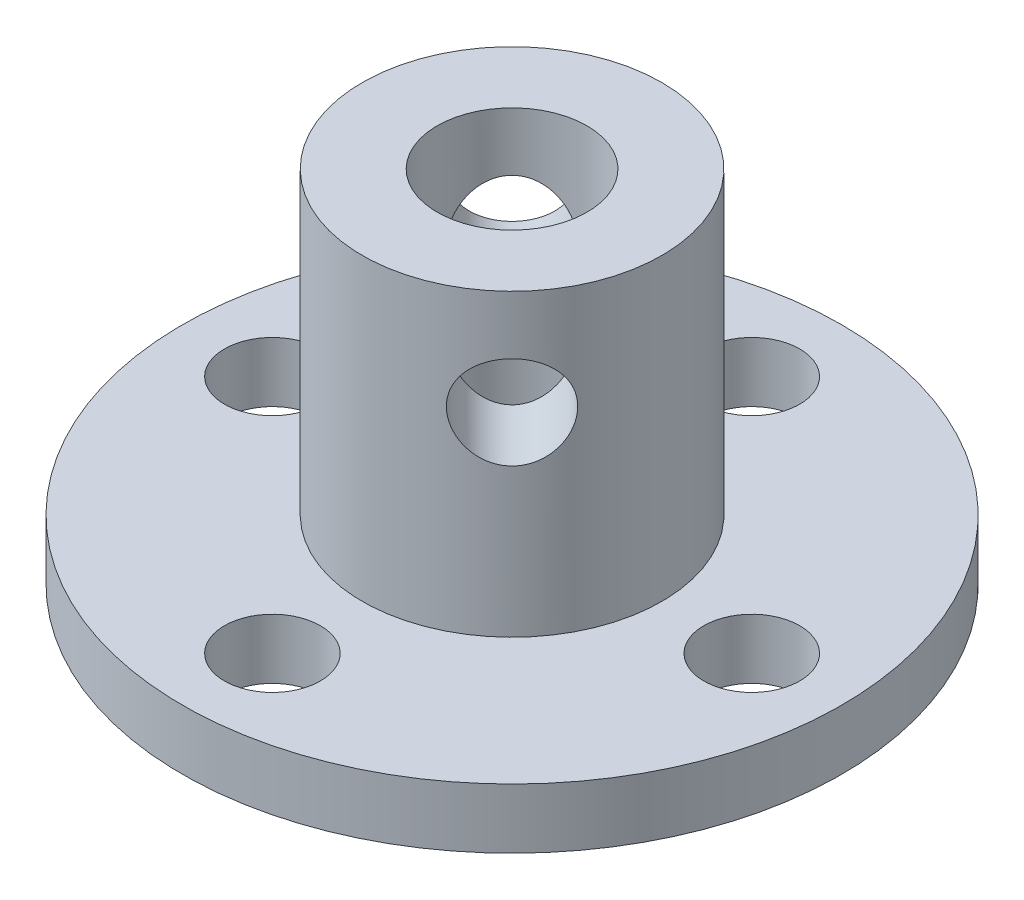
ISO-10303-21;
HEADER;
FILE_DESCRIPTION(('STEP AP214'),'2;1');
FILE_NAME('part.step','',(''),(''),'','','');
FILE_SCHEMA(('AUTOMOTIVE_DESIGN { 1 0 10303 214 1 1 1 1 }'));
ENDSEC;
DATA;
#1=APPLICATION_CONTEXT('core data for automotive mechanical design processes');
#2=APPLICATION_PROTOCOL_DEFINITION('international standard','automotive_design',2000,#1);
#3=PRODUCT_CONTEXT('',#1,'mechanical');
#4=PRODUCT('Part','Part','',(#3));
#5=PRODUCT_RELATED_PRODUCT_CATEGORY('part','',(#4));
#6=PRODUCT_DEFINITION_FORMATION('','',#4);
#7=PRODUCT_DEFINITION_CONTEXT('part definition',#1,'design');
#8=PRODUCT_DEFINITION('design','',#6,#7);
#9=PRODUCT_DEFINITION_SHAPE('','',#8);
#10=(LENGTH_UNIT() NAMED_UNIT(*) SI_UNIT(.MILLI.,.METRE.));
#11=(NAMED_UNIT(*) PLANE_ANGLE_UNIT() SI_UNIT($,.RADIAN.));
#12=(NAMED_UNIT(*) SI_UNIT($,.STERADIAN.) SOLID_ANGLE_UNIT());
#13=UNCERTAINTY_MEASURE_WITH_UNIT(LENGTH_MEASURE(1.E-05),#10,'distance_accuracy_value','');
#14=(GEOMETRIC_REPRESENTATION_CONTEXT(3) GLOBAL_UNCERTAINTY_ASSIGNED_CONTEXT((#13)) GLOBAL_UNIT_ASSIGNED_CONTEXT((#10,
#11,#12)) REPRESENTATION_CONTEXT('',''));
#15=CARTESIAN_POINT('',(0.,0.,0.));
#16=DIRECTION('',(0.,0.,1.));
#17=DIRECTION('',(1.,0.,0.));
#18=AXIS2_PLACEMENT_3D('',#15,#16,#17);
#19=CARTESIAN_POINT('',(0.,0.,0.));
#20=DIRECTION('',(0.,-1.,0.));
#21=DIRECTION('',(0.,0.,-1.));
#22=AXIS2_PLACEMENT_3D('',#19,#20,#21);
#23=CYLINDRICAL_SURFACE('',#22,2.5);
#24=CARTESIAN_POINT('',(0.,12.0139670732778,0.));
#25=DIRECTION('',(0.,-1.,0.));
#26=DIRECTION('',(0.,0.,-1.));
#27=AXIS2_PLACEMENT_3D('',#24,#25,#26);
#28=CIRCLE('',#27,2.5);
#29=CARTESIAN_POINT('',(0.,12.0139670732778,-2.5));
#30=VERTEX_POINT('',#29);
#31=EDGE_CURVE('E67',#30,#30,#28,.T.);
#32=ORIENTED_EDGE('',*,*,#31,.F.);
#33=EDGE_LOOP('',(#32));
#34=FACE_BOUND('',#33,.T.);
#35=CARTESIAN_POINT('',(0.,0.0139670732778078,0.));
#36=DIRECTION('',(0.,-1.,0.));
#37=DIRECTION('',(0.,0.,-1.));
#38=AXIS2_PLACEMENT_3D('',#35,#36,#37);
#39=CIRCLE('',#38,2.5);
#40=CARTESIAN_POINT('',(0.,0.0139670732778078,-2.5));
#41=VERTEX_POINT('',#40);
#42=EDGE_CURVE('E10',#41,#41,#39,.T.);
#43=ORIENTED_EDGE('',*,*,#42,.T.);
#44=EDGE_LOOP('',(#43));
#45=FACE_BOUND('',#44,.T.);
#46=CARTESIAN_POINT('',(-2.48300866150717,8.51396707327781,-0.290977639828875));
#47=CARTESIAN_POINT('',(-2.48301113966516,8.43677846113261,-0.290988913635933));
#48=CARTESIAN_POINT('',(-2.48217612182908,8.3594624686657,-0.298373614279475));
#49=CARTESIAN_POINT('',(-2.47855385305562,8.2074173488581,-0.32705265901617));
#50=CARTESIAN_POINT('',(-2.47576111152277,8.13269611881318,-0.348386112173273));
#51=CARTESIAN_POINT('',(-2.46752440485184,7.98850263384684,-0.402565620860833));
#52=CARTESIAN_POINT('',(-2.46210297547763,7.91899145862871,-0.435313164166938));
#53=CARTESIAN_POINT('',(-2.4477226834508,7.7855720301307,-0.509997366260961));
#54=CARTESIAN_POINT('',(-2.43876382786972,7.72166376565054,-0.551934006679204));
#55=CARTESIAN_POINT('',(-2.41488701565074,7.59200046229165,-0.648945098969827));
#56=CARTESIAN_POINT('',(-2.39933945336666,7.52711144477242,-0.705022520101217));
#57=CARTESIAN_POINT('',(-2.36118189666039,7.40601784165841,-0.823845195773164));
#58=CARTESIAN_POINT('',(-2.33856586237307,7.34982074475389,-0.88659612232111));
#59=CARTESIAN_POINT('',(-2.28192597229858,7.24113691394154,-1.02419487374636));
#60=CARTESIAN_POINT('',(-2.24687081918732,7.18987071508026,-1.09959635294627));
#61=CARTESIAN_POINT('',(-2.16531241404793,7.10161600397076,-1.2525599268235));
#62=CARTESIAN_POINT('',(-2.11882041497775,7.06461354863611,-1.33011983165121));
#63=CARTESIAN_POINT('',(-2.01956902748121,7.00993183833016,-1.47591284545831));
#64=CARTESIAN_POINT('',(-1.96790783367433,6.990685294592,-1.54430042757617));
#65=CARTESIAN_POINT('',(-1.85634664293677,6.96673354831023,-1.67673632370969));
#66=CARTESIAN_POINT('',(-1.79645518444065,6.96201339267015,-1.74078903344187));
#67=CARTESIAN_POINT('',(-1.67896376191841,6.96704686840859,-1.8538722628384));
#68=CARTESIAN_POINT('',(-1.62210670976644,6.97497040446625,-1.9037693991826));
#69=CARTESIAN_POINT('',(-1.5056873068039,7.00154356687289,-1.99711570422354));
#70=CARTESIAN_POINT('',(-1.44612475179436,7.02019400408232,-2.04056438516073));
#71=CARTESIAN_POINT('',(-1.32605698425397,7.06743224779019,-2.12056629360198));
#72=CARTESIAN_POINT('',(-1.26554933285099,7.09605223093485,-2.15709659550747));
#73=CARTESIAN_POINT('',(-1.14559225584083,7.1621617853784,-2.2231312801619));
#74=CARTESIAN_POINT('',(-1.08614308135278,7.19965343207021,-2.25263401567136));
#75=CARTESIAN_POINT('',(-0.962734337897817,7.28764010976322,-2.30830479218215));
#76=CARTESIAN_POINT('',(-0.899124408316367,7.33916920447274,-2.33361107855223));
#77=CARTESIAN_POINT('',(-0.777351283051172,7.45109899040097,-2.37695462987184));
#78=CARTESIAN_POINT('',(-0.719196106739299,7.51151241830252,-2.39498131735296));
#79=CARTESIAN_POINT('',(-0.603700581925183,7.64857294661088,-2.42684344838833));
#80=CARTESIAN_POINT('',(-0.547411508624077,7.72630784930012,-2.43985033900821));
#81=CARTESIAN_POINT('',(-0.448650040605218,7.89078103363736,-2.45993142775213));
#82=CARTESIAN_POINT('',(-0.406152147150563,7.97750230385729,-2.4670166132866));
#83=CARTESIAN_POINT('',(-0.348155928567997,8.13449345961273,-2.4757653126558));
#84=CARTESIAN_POINT('',(-0.328510335770779,8.20317695834715,-2.47835958680787));
#85=CARTESIAN_POINT('',(-0.300940482701998,8.34287009594469,-2.48186134033485));
#86=CARTESIAN_POINT('',(-0.293000704338461,8.41387652740023,-2.48277105329901));
#87=CARTESIAN_POINT('',(-0.289634697403295,8.55634233982426,-2.48316652124736));
#88=CARTESIAN_POINT('',(-0.294234655622526,8.62780235727898,-2.48264929632335));
#89=CARTESIAN_POINT('',(-0.315512571191251,8.7688882668457,-2.48003226794745));
#90=CARTESIAN_POINT('',(-0.332200462979969,8.83851260149722,-2.47793116272951));
#91=CARTESIAN_POINT('',(-0.375824848139076,8.97329275034844,-2.47168503001512));
#92=CARTESIAN_POINT('',(-0.40262326643552,9.03849538957133,-2.46756732596672));
#93=CARTESIAN_POINT('',(-0.464665656065021,9.16447483079389,-2.45663920224406));
#94=CARTESIAN_POINT('',(-0.499912654939246,9.22525003602341,-2.44982781672157));
#95=CARTESIAN_POINT('',(-0.584448365781772,9.35281500683417,-2.43117773014678));
#96=CARTESIAN_POINT('',(-0.635131592028858,9.41857776472977,-2.41863321884564));
#97=CARTESIAN_POINT('',(-0.743646591620364,9.54238494127723,-2.38750564114829));
#98=CARTESIAN_POINT('',(-0.801485672414544,9.60042134226092,-2.36891636987151));
#99=CARTESIAN_POINT('',(-0.93154424839265,9.7162070886581,-2.32114795996202));
#100=CARTESIAN_POINT('',(-1.00460678046814,9.77253670796708,-2.29077907846926));
#101=CARTESIAN_POINT('',(-1.15432243498538,9.87198173576878,-2.21910170268684));
#102=CARTESIAN_POINT('',(-1.23097368665244,9.91510394268841,-2.17779885706388));
#103=CARTESIAN_POINT('',(-1.3795590316548,9.98378629966105,-2.08660631819013));
#104=CARTESIAN_POINT('',(-1.45148713309928,10.0102791045275,-2.03741857202914));
#105=CARTESIAN_POINT('',(-1.59208586805897,10.0481155491427,-1.92952779526033));
#106=CARTESIAN_POINT('',(-1.66076071965088,10.0594793537553,-1.87083754750824));
#107=CARTESIAN_POINT('',(-1.78216921300407,10.0657837739214,-1.75495862400319));
#108=CARTESIAN_POINT('',(-1.83577117456612,10.0628643982258,-1.69878331305819));
#109=CARTESIAN_POINT('',(-1.93672733512432,10.0455666539602,-1.58271862889138));
#110=CARTESIAN_POINT('',(-1.98408173410195,10.0311886522792,-1.52282937464136));
#111=CARTESIAN_POINT('',(-2.07027646916764,9.99233315527852,-1.40329163822625));
#112=CARTESIAN_POINT('',(-2.10933360655769,9.96817936469966,-1.34369224041471));
#113=CARTESIAN_POINT('',(-2.18053469199091,9.91078814134837,-1.22477617153144));
#114=CARTESIAN_POINT('',(-2.21267741311285,9.87754909882513,-1.16545955246003));
#115=CARTESIAN_POINT('',(-2.27335468491183,9.79906333775194,-1.0426080785114));
#116=CARTESIAN_POINT('',(-2.30115576354191,9.75292215688639,-0.979284466016741));
#117=CARTESIAN_POINT('',(-2.3494722557796,9.65188375814969,-0.85692332328773));
#118=CARTESIAN_POINT('',(-2.36997926422846,9.59697654377177,-0.797890799689517));
#119=CARTESIAN_POINT('',(-2.40716561061507,9.47099841242396,-0.678236947556122));
#120=CARTESIAN_POINT('',(-2.42289783021863,9.3987400437893,-0.61856477966634));
#121=CARTESIAN_POINT('',(-2.44788878392887,9.24500242671703,-0.51078802328311));
#122=CARTESIAN_POINT('',(-2.4571515302649,9.16352892980405,-0.462676277430287));
#123=CARTESIAN_POINT('',(-2.46943482027336,9.01168914833024,-0.391036588535258));
#124=CARTESIAN_POINT('',(-2.47338303267701,8.9428537329483,-0.364424613038904));
#125=CARTESIAN_POINT('',(-2.47916014627634,8.80177271359199,-0.322827872056454));
#126=CARTESIAN_POINT('',(-2.48099587218898,8.7295388804901,-0.307805715985435));
#127=CARTESIAN_POINT('',(-2.48235257585556,8.63295465826136,-0.296529506160038));
#128=CARTESIAN_POINT('',(-2.48259955048018,8.60921128396243,-0.294451966379689));
#129=CARTESIAN_POINT('',(-2.48292722976129,8.56163836082481,-0.291674133259536));
#130=CARTESIAN_POINT('',(-2.48300789606331,8.5378087933771,-0.290974157618936));
#131=CARTESIAN_POINT('',(-2.48300866150717,8.51396707327781,-0.290977639828875));
#132=B_SPLINE_CURVE_WITH_KNOTS('',3,(#46,#47,#48,#49,#50,#51,#52,#53,#54,#55,#56,#57,#58,#59,
#60,#61,#62,#63,#64,#65,#66,#67,#68,#69,#70,#71,#72,#73,#74,#75,#76,#77,#78,#79,#80,#81,#82,#83,
#84,#85,#86,#87,#88,#89,#90,#91,#92,#93,#94,#95,#96,#97,#98,#99,#100,#101,#102,#103,#104,#105,
#106,#107,#108,#109,#110,#111,#112,#113,#114,#115,#116,#117,#118,#119,#120,#121,#122,#123,#124,
#125,#126,#127,#128,#129,#130,#131),.UNSPECIFIED.,.T.,.F.,(4,2,2,2,2,2,2,2,2,2,2,2,2,2,2,2,2,2,
2,2,2,2,2,2,2,2,2,2,2,2,2,2,2,2,2,2,2,2,2,2,2,2,4),(0.,0.231456339426909,0.463564427654229,
0.693716921414024,0.923868955086429,1.18434367634497,1.44504157926139,1.7365052726148,
2.02768332765056,2.28962147159727,2.55128989270335,2.77838248441688,3.00549224461248,
3.23334189748081,3.46124490515298,3.71729257741081,3.9737109671375,4.26285545981545,
4.55146226161879,4.76501730225856,4.97828898320938,5.19200638140646,5.40589962230755,
5.61697175694569,5.82811964246893,6.07908480116541,6.33030839041904,6.62020835252442,
6.90995883880151,7.18151717561235,7.45271319916047,7.68463598418857,7.9165513436777,
8.14134480760435,8.36617812692507,8.61462416793252,8.8633555796891,9.14715079466205,
9.43076984923751,9.65163722229324,9.87178902774295,9.94326388514901,10.0147552244342),.UNSPECIFIED.);
#133=CARTESIAN_POINT('',(-2.48300866150717,8.51396707327781,-0.290977639828875));
#134=VERTEX_POINT('',#133);
#135=EDGE_CURVE('E90',#134,#134,#132,.T.);
#136=ORIENTED_EDGE('',*,*,#135,.F.);
#137=EDGE_LOOP('',(#136));
#138=FACE_BOUND('',#137,.T.);
#139=CARTESIAN_POINT('',(0.290977639828865,8.51396707327781,2.48300866150717));
#140=CARTESIAN_POINT('',(0.290988913635924,8.591155685423,2.48301113966515));
#141=CARTESIAN_POINT('',(0.298373614279466,8.66847167788991,2.48217612182908));
#142=CARTESIAN_POINT('',(0.327052659016161,8.8205167976975,2.47855385305562));
#143=CARTESIAN_POINT('',(0.348386112173264,8.89523802774243,2.47576111152277));
#144=CARTESIAN_POINT('',(0.402565620860824,9.03943151270877,2.46752440485184));
#145=CARTESIAN_POINT('',(0.435313164166929,9.1089426879269,2.46210297547763));
#146=CARTESIAN_POINT('',(0.509997366260951,9.24236211642492,2.4477226834508));
#147=CARTESIAN_POINT('',(0.551934006679195,9.30627038090507,2.43876382786972));
#148=CARTESIAN_POINT('',(0.648945098969817,9.43593368426396,2.41488701565074));
#149=CARTESIAN_POINT('',(0.705022520101206,9.50082270178319,2.39933945336667));
#150=CARTESIAN_POINT('',(0.823845195773153,9.6219163048972,2.36118189666039));
#151=CARTESIAN_POINT('',(0.886596122321099,9.67811340180172,2.33856586237307));
#152=CARTESIAN_POINT('',(1.02419487374635,9.78679723261407,2.28192597229859));
#153=CARTESIAN_POINT('',(1.09959635294626,9.83806343147536,2.24687081918733));
#154=CARTESIAN_POINT('',(1.25255992682349,9.92631814258485,2.16531241404794));
#155=CARTESIAN_POINT('',(1.3301198316512,9.9633205979195,2.11882041497775));
#156=CARTESIAN_POINT('',(1.4759128454583,10.0180023082254,2.01956902748121));
#157=CARTESIAN_POINT('',(1.54430042757616,10.0372488519636,1.96790783367434));
#158=CARTESIAN_POINT('',(1.67673632370968,10.0612005982454,1.85634664293678));
#159=CARTESIAN_POINT('',(1.74078903344186,10.0659207538855,1.79645518444066));
#160=CARTESIAN_POINT('',(1.85387226283839,10.060887278147,1.67896376191842));
#161=CARTESIAN_POINT('',(1.90376939918259,10.0529637420894,1.62210670976645));
#162=CARTESIAN_POINT('',(1.99711570422354,10.0263905796827,1.50568730680391));
#163=CARTESIAN_POINT('',(2.04056438516073,10.0077401424733,1.44612475179436));
#164=CARTESIAN_POINT('',(2.12056629360198,9.96050189876543,1.32605698425398));
#165=CARTESIAN_POINT('',(2.15709659550746,9.93188191562076,1.265549332851));
#166=CARTESIAN_POINT('',(2.22313128016189,9.86577236117722,1.14559225584084));
#167=CARTESIAN_POINT('',(2.25263401567135,9.82828071448541,1.08614308135279));
#168=CARTESIAN_POINT('',(2.30830479218214,9.74029403679239,0.962734337897826));
#169=CARTESIAN_POINT('',(2.33361107855223,9.68876494208287,0.899124408316376));
#170=CARTESIAN_POINT('',(2.37695462987183,9.57683515615465,0.777351283051182));
#171=CARTESIAN_POINT('',(2.39498131735296,9.51642172825309,0.719196106739309));
#172=CARTESIAN_POINT('',(2.42684344838833,9.37936119994474,0.603700581925193));
#173=CARTESIAN_POINT('',(2.4398503390082,9.30162629725549,0.547411508624086));
#174=CARTESIAN_POINT('',(2.45993142775213,9.13715311291826,0.448650040605227));
#175=CARTESIAN_POINT('',(2.4670166132866,9.05043184269833,0.406152147150572));
#176=CARTESIAN_POINT('',(2.4757653126558,8.89344068694289,0.348155928568007));
#177=CARTESIAN_POINT('',(2.47835958680787,8.82475718820847,0.32851033577079));
#178=CARTESIAN_POINT('',(2.48186134033485,8.68506405061092,0.300940482702008));
#179=CARTESIAN_POINT('',(2.48277105329901,8.61405761915538,0.29300070433847));
#180=CARTESIAN_POINT('',(2.48316652124736,8.47159180673136,0.289634697403303));
#181=CARTESIAN_POINT('',(2.48264929632335,8.40013178927664,0.294234655622536));
#182=CARTESIAN_POINT('',(2.48003226794745,8.25904587970991,0.315512571191261));
#183=CARTESIAN_POINT('',(2.47793116272951,8.1894215450584,0.332200462979978));
#184=CARTESIAN_POINT('',(2.47168503001512,8.05464139620717,0.375824848139085));
#185=CARTESIAN_POINT('',(2.46756732596671,7.98943875698428,0.402623266435529));
#186=CARTESIAN_POINT('',(2.45663920224406,7.86345931576172,0.464665656065029));
#187=CARTESIAN_POINT('',(2.44982781672157,7.8026841105322,0.499912654939255));
#188=CARTESIAN_POINT('',(2.43117773014678,7.67511913972144,0.584448365781778));
#189=CARTESIAN_POINT('',(2.41863321884563,7.60935638182585,0.635131592028864));
#190=CARTESIAN_POINT('',(2.38750564114828,7.48554920527839,0.743646591620369));
#191=CARTESIAN_POINT('',(2.36891636987151,7.4275128042947,0.801485672414549));
#192=CARTESIAN_POINT('',(2.32114795996202,7.31172705789751,0.931544248392655));
#193=CARTESIAN_POINT('',(2.29077907846926,7.25539743858854,1.00460678046815));
#194=CARTESIAN_POINT('',(2.21910170268684,7.15595241078683,1.15432243498538));
#195=CARTESIAN_POINT('',(2.17779885706388,7.11283020386721,1.23097368665244));
#196=CARTESIAN_POINT('',(2.08660631819013,7.04414784689457,1.37955903165481));
#197=CARTESIAN_POINT('',(2.03741857202913,7.01765504202814,1.45148713309929));
#198=CARTESIAN_POINT('',(1.92952779526033,6.97981859741287,1.59208586805897));
#199=CARTESIAN_POINT('',(1.87083754750823,6.96845479280031,1.66076071965089));
#200=CARTESIAN_POINT('',(1.75495862400318,6.96215037263419,1.78216921300408));
#201=CARTESIAN_POINT('',(1.69878331305819,6.96506974832984,1.83577117456613));
#202=CARTESIAN_POINT('',(1.58271862889138,6.98236749259538,1.93672733512432));
#203=CARTESIAN_POINT('',(1.52282937464136,6.99674549427638,1.98408173410195));
#204=CARTESIAN_POINT('',(1.40329163822625,7.03560099127709,2.07027646916765));
#205=CARTESIAN_POINT('',(1.3436922404147,7.05975478185595,2.1093336065577));
#206=CARTESIAN_POINT('',(1.22477617153143,7.11714600520724,2.18053469199092));
#207=CARTESIAN_POINT('',(1.16545955246002,7.15038504773048,2.21267741311285));
#208=CARTESIAN_POINT('',(1.04260807851139,7.22887080880367,2.27335468491183));
#209=CARTESIAN_POINT('',(0.979284466016735,7.27501198966922,2.30115576354191));
#210=CARTESIAN_POINT('',(0.856923323287723,7.37605038840592,2.3494722557796));
#211=CARTESIAN_POINT('',(0.79789079968951,7.43095760278384,2.36997926422847));
#212=CARTESIAN_POINT('',(0.678236947556115,7.55693573413166,2.40716561061507));
#213=CARTESIAN_POINT('',(0.618564779666332,7.62919410276631,2.42289783021863));
#214=CARTESIAN_POINT('',(0.510788023283101,7.78293171983858,2.44788878392887));
#215=CARTESIAN_POINT('',(0.462676277430279,7.86440521675157,2.4571515302649));
#216=CARTESIAN_POINT('',(0.39103658853525,8.01624499822537,2.46943482027336));
#217=CARTESIAN_POINT('',(0.364424613038896,8.08508041360731,2.47338303267701));
#218=CARTESIAN_POINT('',(0.322827872056446,8.22616143296362,2.47916014627634));
#219=CARTESIAN_POINT('',(0.307805715985428,8.29839526606551,2.48099587218898));
#220=CARTESIAN_POINT('',(0.296529506160029,8.39497948829425,2.48235257585556));
#221=CARTESIAN_POINT('',(0.29445196637968,8.41872286259318,2.48259955048018));
#222=CARTESIAN_POINT('',(0.291674133259526,8.4662957857308,2.48292722976129));
#223=CARTESIAN_POINT('',(0.290974157618926,8.49012535317851,2.48300789606331));
#224=CARTESIAN_POINT('',(0.290977639828865,8.51396707327781,2.48300866150717));
#225=B_SPLINE_CURVE_WITH_KNOTS('',3,(#139,#140,#141,#142,#143,#144,#145,#146,#147,#148,#149,
#150,#151,#152,#153,#154,#155,#156,#157,#158,#159,#160,#161,#162,#163,#164,#165,#166,#167,#168,
#169,#170,#171,#172,#173,#174,#175,#176,#177,#178,#179,#180,#181,#182,#183,#184,#185,#186,#187,
#188,#189,#190,#191,#192,#193,#194,#195,#196,#197,#198,#199,#200,#201,#202,#203,#204,#205,#206,
#207,#208,#209,#210,#211,#212,#213,#214,#215,#216,#217,#218,#219,#220,#221,#222,#223,#224),
.UNSPECIFIED.,.T.,.F.,(4,2,2,2,2,2,2,2,2,2,2,2,2,2,2,2,2,2,2,2,2,2,2,2,2,2,2,2,2,2,2,2,2,2,2,2,
2,2,2,2,2,2,4),(0.,0.231456339426906,0.463564427654227,0.693716921414023,0.923868955086427,
1.18434367634497,1.44504157926139,1.7365052726148,2.02768332765056,2.28962147159726,
2.55128989270335,2.77838248441688,3.00549224461248,3.23334189748081,3.46124490515298,
3.71729257741081,3.97371096713749,4.26285545981545,4.55146226161879,4.76501730225856,
4.97828898320938,5.19200638140646,5.40589962230755,5.61697175694569,5.82811964246893,
6.07908480116541,6.33030839041903,6.62020835252442,6.9099588388015,7.18151717561234,
7.45271319916047,7.68463598418857,7.9165513436777,8.14134480760435,8.36617812692507,
8.61462416793252,8.8633555796891,9.14715079466205,9.43076984923751,9.65163722229324,
9.87178902774295,9.94326388514901,10.0147552244342),.UNSPECIFIED.);
#226=CARTESIAN_POINT('',(0.290977639828865,8.51396707327781,2.48300866150717));
#227=VERTEX_POINT('',#226);
#228=EDGE_CURVE('E95',#227,#227,#225,.T.);
#229=ORIENTED_EDGE('',*,*,#228,.F.);
#230=EDGE_LOOP('',(#229));
#231=FACE_BOUND('',#230,.T.);
#232=ADVANCED_FACE('F33',(#34,#45,#138,#231),#23,.F.);
#233=CARTESIAN_POINT('',(0.,0.,0.));
#234=DIRECTION('',(0.,-1.,0.));
#235=DIRECTION('',(0.,0.,-1.));
#236=AXIS2_PLACEMENT_3D('',#233,#234,#235);
#237=CYLINDRICAL_SURFACE('',#236,5.);
#238=CARTESIAN_POINT('',(0.,2.01396707327781,0.));
#239=DIRECTION('',(0.,-1.,0.));
#240=DIRECTION('',(0.,0.,-1.));
#241=AXIS2_PLACEMENT_3D('',#238,#239,#240);
#242=CIRCLE('',#241,5.);
#243=CARTESIAN_POINT('',(0.,2.01396707327781,-5.));
#244=VERTEX_POINT('',#243);
#245=EDGE_CURVE('E117',#244,#244,#242,.T.);
#246=ORIENTED_EDGE('',*,*,#245,.F.);
#247=EDGE_LOOP('',(#246));
#248=FACE_BOUND('',#247,.T.);
#249=CARTESIAN_POINT('',(0.,12.0139670732778,0.));
#250=DIRECTION('',(0.,-1.,0.));
#251=DIRECTION('',(0.,0.,-1.));
#252=AXIS2_PLACEMENT_3D('',#249,#250,#251);
#253=CIRCLE('',#252,5.);
#254=CARTESIAN_POINT('',(0.,12.0139670732778,-5.));
#255=VERTEX_POINT('',#254);
#256=EDGE_CURVE('E114',#255,#255,#253,.T.);
#257=ORIENTED_EDGE('',*,*,#256,.T.);
#258=EDGE_LOOP('',(#257));
#259=FACE_BOUND('',#258,.T.);
#260=CARTESIAN_POINT('',(-4.45737684220476,8.51396707327781,-2.26534582052647));
#261=CARTESIAN_POINT('',(-4.4573767890161,8.59875484753556,-2.2653467227091));
#262=CARTESIAN_POINT('',(-4.45406232735722,8.68354939133934,-2.27190349660731));
#263=CARTESIAN_POINT('',(-4.44078695967672,8.85064979084057,-2.29774158344845));
#264=CARTESIAN_POINT('',(-4.43082417261666,8.93295493531068,-2.31702649760026));
#265=CARTESIAN_POINT('',(-4.40422435111833,9.09263223926999,-2.36719356668621));
#266=CARTESIAN_POINT('',(-4.38759897979492,9.17001274665165,-2.39805544967705));
#267=CARTESIAN_POINT('',(-4.3475931065517,9.31806302619018,-2.46984134604357));
#268=CARTESIAN_POINT('',(-4.3242114474674,9.38873164602992,-2.5107670828989));
#269=CARTESIAN_POINT('',(-4.26978602254055,9.52374086478658,-2.60227600764689));
#270=CARTESIAN_POINT('',(-4.23852940918248,9.58782117487919,-2.65311671450682));
#271=CARTESIAN_POINT('',(-4.16872917591554,9.70551087796587,-2.76149343600196));
#272=CARTESIAN_POINT('',(-4.13018455670836,9.75911883298626,-2.81903036837679));
#273=CARTESIAN_POINT('',(-4.04503726712049,9.85548696605033,-2.93994092686625));
#274=CARTESIAN_POINT('',(-3.99827457189386,9.89797962720575,-3.00341583955249));
#275=CARTESIAN_POINT('',(-3.89786232134122,9.96915062506135,-3.13262703598672));
#276=CARTESIAN_POINT('',(-3.84421436115085,9.99783215414861,-3.19836279338214));
#277=CARTESIAN_POINT('',(-3.73281374044518,10.0396992039132,-3.327635382562));
#278=CARTESIAN_POINT('',(-3.67523554183505,10.0533294830565,-3.39117828698183));
#279=CARTESIAN_POINT('',(-3.55608388490937,10.0661157218249,-3.51592091248954));
#280=CARTESIAN_POINT('',(-3.49451132382877,10.0652749208826,-3.57712115492123));
#281=CARTESIAN_POINT('',(-3.37140948488425,10.0494366551378,-3.69330795665653));
#282=CARTESIAN_POINT('',(-3.30994983670373,10.0349212261524,-3.74843499575612));
#283=CARTESIAN_POINT('',(-3.18702481973148,9.9929359619555,-3.85349372759538));
#284=CARTESIAN_POINT('',(-3.12555945082728,9.96546528650914,-3.90342508310358));
#285=CARTESIAN_POINT('',(-3.00391891698407,9.89803623812037,-3.99780874065319));
#286=CARTESIAN_POINT('',(-2.94376842790876,9.85793050844349,-4.04218727865625));
#287=CARTESIAN_POINT('',(-2.82759902834129,9.76648767944765,-4.12428795178697));
#288=CARTESIAN_POINT('',(-2.77158115448698,9.71514777483659,-4.16200842006629));
#289=CARTESIAN_POINT('',(-2.66350633031111,9.60021399316885,-4.23202702802209));
#290=CARTESIAN_POINT('',(-2.61170630249755,9.53620366859819,-4.26403908718729));
#291=CARTESIAN_POINT('',(-2.51692070906888,9.39902107679706,-4.32066737130256));
#292=CARTESIAN_POINT('',(-2.47393614760495,9.32584776735759,-4.34528275386119));
#293=CARTESIAN_POINT('',(-2.39839892626046,9.17134652885634,-4.38743453945198));
#294=CARTESIAN_POINT('',(-2.3659644893189,9.08993874986301,-4.40489125347641));
#295=CARTESIAN_POINT('',(-2.31397846760274,8.92193108195896,-4.43242360688282));
#296=CARTESIAN_POINT('',(-2.29442234159586,8.83533303503855,-4.44250184824922));
#297=CARTESIAN_POINT('',(-2.26988532351512,8.66307675860611,-4.45508747380521));
#298=CARTESIAN_POINT('',(-2.26435807566107,8.57751704089207,-4.4578787783553));
#299=CARTESIAN_POINT('',(-2.26662357089746,8.40662794798682,-4.4567275123494));
#300=CARTESIAN_POINT('',(-2.2744142958216,8.32129853985768,-4.45278596207044));
#301=CARTESIAN_POINT('',(-2.30243222327353,8.15580374520168,-4.43836000368797));
#302=CARTESIAN_POINT('',(-2.32230110411869,8.07556055297006,-4.42806398343519));
#303=CARTESIAN_POINT('',(-2.37309814714173,7.91980021700927,-4.40104842258409));
#304=CARTESIAN_POINT('',(-2.4040280939328,7.84428383822465,-4.38432784540325));
#305=CARTESIAN_POINT('',(-2.47649030188912,7.69775512611004,-4.34381864510179));
#306=CARTESIAN_POINT('',(-2.51829793348379,7.62693083320977,-4.31984332094283));
#307=CARTESIAN_POINT('',(-2.61021407560655,7.49387916610259,-4.2649318403792));
#308=CARTESIAN_POINT('',(-2.6603247078394,7.43165399674328,-4.23399390405975));
#309=CARTESIAN_POINT('',(-2.76904998869855,7.31495593968488,-4.16373771893935));
#310=CARTESIAN_POINT('',(-2.82792767979773,7.26090146210245,-4.12412972356242));
#311=CARTESIAN_POINT('',(-2.9502163613376,7.16523068637543,-4.03755217672728));
#312=CARTESIAN_POINT('',(-3.01362713988175,7.12361380731301,-3.99058296924242));
#313=CARTESIAN_POINT('',(-3.14209582605383,7.05439967480833,-3.89022125640913));
#314=CARTESIAN_POINT('',(-3.2071379116788,7.02670012254402,-3.8368792979072));
#315=CARTESIAN_POINT('',(-3.33691813234819,6.98586208483177,-3.7245577679353));
#316=CARTESIAN_POINT('',(-3.40165635474122,6.97271912260446,-3.6655799358044));
#317=CARTESIAN_POINT('',(-3.52596329645407,6.96172633968484,-3.54608412871196));
#318=CARTESIAN_POINT('',(-3.58563514117763,6.96327166828954,-3.48572840780132));
#319=CARTESIAN_POINT('',(-3.70090220143961,6.98015230911232,-3.36309437826233));
#320=CARTESIAN_POINT('',(-3.75649767534981,6.99548674651955,-3.30081619184137));
#321=CARTESIAN_POINT('',(-3.86165385250009,7.03912730048841,-3.17712855160195));
#322=CARTESIAN_POINT('',(-3.91127961449674,7.06727370856841,-3.11571772856925));
#323=CARTESIAN_POINT('',(-4.00445606572658,7.13559528356766,-2.99502106834855));
#324=CARTESIAN_POINT('',(-4.04800571930141,7.17577249744658,-2.93573559469783));
#325=CARTESIAN_POINT('',(-4.12994024231261,7.26857447903881,-2.81936698009658));
#326=CARTESIAN_POINT('',(-4.16810289956174,7.32157153499439,-2.76242439362524));
#327=CARTESIAN_POINT('',(-4.2373048903125,7.43784941347284,-2.65505840660432));
#328=CARTESIAN_POINT('',(-4.26834210221667,7.50113328933551,-2.60463694966375));
#329=CARTESIAN_POINT('',(-4.32419406634636,7.63865035343603,-2.51086162036744));
#330=CARTESIAN_POINT('',(-4.34877422980301,7.71317219855547,-2.46779016959921));
#331=CARTESIAN_POINT('',(-4.39043346894494,7.86958828792149,-2.39289381569112));
#332=CARTESIAN_POINT('',(-4.40751569708633,7.951479416318,-2.36106418710498));
#333=CARTESIAN_POINT('',(-4.43307882610864,8.1127396350336,-2.31268107217275));
#334=CARTESIAN_POINT('',(-4.44219453080548,8.19167448651848,-2.29501219345555));
#335=CARTESIAN_POINT('',(-4.45434284504807,8.35172686458557,-2.27134551599259));
#336=CARTESIAN_POINT('',(-4.45737689309458,8.43284387041915,-2.26534495733665));
#337=CARTESIAN_POINT('',(-4.45737684220476,8.51396707327781,-2.26534582052647));
#338=B_SPLINE_CURVE_WITH_KNOTS('',3,(#260,#261,#262,#263,#264,#265,#266,#267,#268,#269,#270,
#271,#272,#273,#274,#275,#276,#277,#278,#279,#280,#281,#282,#283,#284,#285,#286,#287,#288,#289,
#290,#291,#292,#293,#294,#295,#296,#297,#298,#299,#300,#301,#302,#303,#304,#305,#306,#307,#308,
#309,#310,#311,#312,#313,#314,#315,#316,#317,#318,#319,#320,#321,#322,#323,#324,#325,#326,#327,
#328,#329,#330,#331,#332,#333,#334,#335,#336,#337),.UNSPECIFIED.,.T.,.F.,(4,2,2,2,2,2,2,2,2,2,2,
2,2,2,2,2,2,2,2,2,2,2,2,2,2,2,2,2,2,2,2,2,2,2,2,2,2,2,4),(0.,0.254063742253647,
0.508199398316739,0.761892109785907,1.0156282975521,1.27714024483141,1.53868807547997,
1.80604772654606,2.07334554881432,2.33251389937151,2.59162423439109,2.84192960726694,
3.09225121636408,3.34560759426359,3.59902731027014,3.86284785498961,4.12669843427996,
4.39341124807614,4.66002996146249,4.91609377382727,5.17211878647721,5.42089570959393,
5.6697127889699,5.92557410205819,6.18150089770881,6.44784025735558,6.71416717525435,
6.97850672862432,7.24276496358546,7.49619000104125,7.74959896179962,7.99993206355678,
8.25030778201048,8.50908094556254,8.76793105904189,9.03518047186343,9.30231741359697,
9.5454579067485,9.78854088282967),.UNSPECIFIED.);
#339=CARTESIAN_POINT('',(-4.45737684220476,8.51396707327781,-2.26534582052647));
#340=VERTEX_POINT('',#339);
#341=EDGE_CURVE('E68',#340,#340,#338,.T.);
#342=ORIENTED_EDGE('',*,*,#341,.F.);
#343=EDGE_LOOP('',(#342));
#344=FACE_BOUND('',#343,.T.);
#345=CARTESIAN_POINT('',(2.26534582052645,8.51396707327781,4.45737684220476));
#346=CARTESIAN_POINT('',(2.26534672270908,8.42917929902006,4.4573767890161));
#347=CARTESIAN_POINT('',(2.2719034966073,8.34438475521628,4.45406232735723));
#348=CARTESIAN_POINT('',(2.29774158344843,8.17728435571504,4.44078695967673));
#349=CARTESIAN_POINT('',(2.31702649760025,8.09497921124493,4.43082417261667));
#350=CARTESIAN_POINT('',(2.3671935666862,7.93530190728562,4.40422435111834));
#351=CARTESIAN_POINT('',(2.39805544967704,7.85792139990396,4.38759897979493));
#352=CARTESIAN_POINT('',(2.46984134604356,7.70987112036543,4.3475931065517));
#353=CARTESIAN_POINT('',(2.51076708289889,7.63920250052569,4.32421144746741));
#354=CARTESIAN_POINT('',(2.60227600764687,7.50419328176903,4.26978602254056));
#355=CARTESIAN_POINT('',(2.65311671450681,7.44011297167643,4.23852940918249));
#356=CARTESIAN_POINT('',(2.76149343600195,7.32242326858974,4.16872917591555));
#357=CARTESIAN_POINT('',(2.81903036837678,7.26881531356935,4.13018455670837));
#358=CARTESIAN_POINT('',(2.93994092686624,7.17244718050528,4.0450372671205));
#359=CARTESIAN_POINT('',(3.00341583955247,7.12995451934986,3.99827457189387));
#360=CARTESIAN_POINT('',(3.1326270359867,7.05878352149427,3.89786232134123));
#361=CARTESIAN_POINT('',(3.19836279338213,7.030101992407,3.84421436115086));
#362=CARTESIAN_POINT('',(3.32763538256199,6.98823494264245,3.73281374044519));
#363=CARTESIAN_POINT('',(3.39117828698182,6.97460466349908,3.67523554183506));
#364=CARTESIAN_POINT('',(3.51592091248953,6.96181842473067,3.55608388490938));
#365=CARTESIAN_POINT('',(3.57712115492121,6.96265922567301,3.49451132382878));
#366=CARTESIAN_POINT('',(3.69330795665652,6.97849749141778,3.37140948488426));
#367=CARTESIAN_POINT('',(3.7484349957561,6.99301292040324,3.30994983670374));
#368=CARTESIAN_POINT('',(3.85349372759537,7.03499818460012,3.1870248197315));
#369=CARTESIAN_POINT('',(3.90342508310357,7.06246886004647,3.12555945082729));
#370=CARTESIAN_POINT('',(3.99780874065318,7.12989790843524,3.00391891698408));
#371=CARTESIAN_POINT('',(4.04218727865624,7.17000363811212,2.94376842790877));
#372=CARTESIAN_POINT('',(4.12428795178696,7.26144646710796,2.82759902834131));
#373=CARTESIAN_POINT('',(4.16200842006628,7.31278637171903,2.77158115448699));
#374=CARTESIAN_POINT('',(4.23202702802208,7.42772015338677,2.66350633031113));
#375=CARTESIAN_POINT('',(4.26403908718729,7.49173047795742,2.61170630249756));
#376=CARTESIAN_POINT('',(4.32066737130255,7.62891306975855,2.51692070906889));
#377=CARTESIAN_POINT('',(4.34528275386119,7.70208637919802,2.47393614760497));
#378=CARTESIAN_POINT('',(4.38743453945197,7.85658761769928,2.39839892626048));
#379=CARTESIAN_POINT('',(4.4048912534764,7.93799539669261,2.36596448931891));
#380=CARTESIAN_POINT('',(4.43242360688282,8.10600306459665,2.31397846760276));
#381=CARTESIAN_POINT('',(4.44250184824921,8.19260111151707,2.29442234159587));
#382=CARTESIAN_POINT('',(4.4550874738052,8.3648573879495,2.26988532351514));
#383=CARTESIAN_POINT('',(4.45787877835529,8.45041710566355,2.26435807566109));
#384=CARTESIAN_POINT('',(4.45672751234939,8.62130619856879,2.26662357089747));
#385=CARTESIAN_POINT('',(4.45278596207043,8.70663560669793,2.27441429582162));
#386=CARTESIAN_POINT('',(4.43836000368796,8.87213040135394,2.30243222327354));
#387=CARTESIAN_POINT('',(4.42806398343518,8.95237359358555,2.32230110411871));
#388=CARTESIAN_POINT('',(4.40104842258408,9.10813392954634,2.37309814714174));
#389=CARTESIAN_POINT('',(4.38432784540324,9.18365030833097,2.40402809393282));
#390=CARTESIAN_POINT('',(4.34381864510178,9.33017902044557,2.47649030188913));
#391=CARTESIAN_POINT('',(4.31984332094282,9.40100331334584,2.51829793348381));
#392=CARTESIAN_POINT('',(4.26493184037919,9.53405498045303,2.61021407560656));
#393=CARTESIAN_POINT('',(4.23399390405974,9.59628014981233,2.66032470783942));
#394=CARTESIAN_POINT('',(4.16373771893934,9.71297820687073,2.76904998869857));
#395=CARTESIAN_POINT('',(4.12412972356241,9.76703268445316,2.82792767979775));
#396=CARTESIAN_POINT('',(4.03755217672727,9.86270346018019,2.95021636133761));
#397=CARTESIAN_POINT('',(3.99058296924241,9.9043203392426,3.01362713988177));
#398=CARTESIAN_POINT('',(3.89022125640912,9.97353447174729,3.14209582605384));
#399=CARTESIAN_POINT('',(3.83687929790719,10.0012340240116,3.20713791167881));
#400=CARTESIAN_POINT('',(3.72455776793529,10.0420720617238,3.3369181323482));
#401=CARTESIAN_POINT('',(3.66557993580438,10.0552150239512,3.40165635474123));
#402=CARTESIAN_POINT('',(3.54608412871194,10.0662078068708,3.52596329645408));
#403=CARTESIAN_POINT('',(3.48572840780131,10.0646624782661,3.58563514117764));
#404=CARTESIAN_POINT('',(3.36309437826231,10.0477818374433,3.70090220143962));
#405=CARTESIAN_POINT('',(3.30081619184135,10.0324474000361,3.75649767534982));
#406=CARTESIAN_POINT('',(3.17712855160193,9.9888068460672,3.8616538525001));
#407=CARTESIAN_POINT('',(3.11571772856924,9.9606604379872,3.91127961449675));
#408=CARTESIAN_POINT('',(2.99502106834854,9.89233886298795,4.0044560657266));
#409=CARTESIAN_POINT('',(2.93573559469782,9.85216164910903,4.04800571930143));
#410=CARTESIAN_POINT('',(2.81936698009657,9.7593596675168,4.12994024231262));
#411=CARTESIAN_POINT('',(2.76242439362523,9.70636261156122,4.16810289956175));
#412=CARTESIAN_POINT('',(2.6550584066043,9.59008473308277,4.23730489031251));
#413=CARTESIAN_POINT('',(2.60463694966374,9.5268008572201,4.26834210221668));
#414=CARTESIAN_POINT('',(2.51086162036743,9.38928379311958,4.32419406634637));
#415=CARTESIAN_POINT('',(2.46779016959919,9.31476194800015,4.34877422980302));
#416=CARTESIAN_POINT('',(2.3928938156911,9.15834585863413,4.39043346894495));
#417=CARTESIAN_POINT('',(2.36106418710496,9.07645473023761,4.40751569708633));
#418=CARTESIAN_POINT('',(2.31268107217274,8.91519451152202,4.43307882610865));
#419=CARTESIAN_POINT('',(2.29501219345554,8.83625966003714,4.44219453080549));
#420=CARTESIAN_POINT('',(2.27134551599257,8.67620728197005,4.45434284504808));
#421=CARTESIAN_POINT('',(2.26534495733663,8.59509027613647,4.45737689309458));
#422=CARTESIAN_POINT('',(2.26534582052645,8.51396707327781,4.45737684220476));
#423=B_SPLINE_CURVE_WITH_KNOTS('',3,(#345,#346,#347,#348,#349,#350,#351,#352,#353,#354,#355,
#356,#357,#358,#359,#360,#361,#362,#363,#364,#365,#366,#367,#368,#369,#370,#371,#372,#373,#374,
#375,#376,#377,#378,#379,#380,#381,#382,#383,#384,#385,#386,#387,#388,#389,#390,#391,#392,#393,
#394,#395,#396,#397,#398,#399,#400,#401,#402,#403,#404,#405,#406,#407,#408,#409,#410,#411,#412,
#413,#414,#415,#416,#417,#418,#419,#420,#421,#422),.UNSPECIFIED.,.T.,.F.,(4,2,2,2,2,2,2,2,2,2,2,
2,2,2,2,2,2,2,2,2,2,2,2,2,2,2,2,2,2,2,2,2,2,2,2,2,2,2,4),(0.,0.254063742253647,
0.508199398316739,0.761892109785908,1.0156282975521,1.27714024483141,1.53868807547997,
1.80604772654606,2.07334554881432,2.33251389937151,2.59162423439109,2.84192960726694,
3.09225121636408,3.34560759426359,3.59902731027014,3.86284785498961,4.12669843427996,
4.39341124807614,4.66002996146249,4.91609377382727,5.17211878647721,5.42089570959393,
5.6697127889699,5.92557410205819,6.18150089770881,6.44784025735558,6.71416717525435,
6.97850672862433,7.24276496358546,7.49619000104125,7.74959896179962,7.99993206355678,
8.25030778201048,8.50908094556254,8.76793105904189,9.03518047186343,9.30231741359697,
9.5454579067485,9.78854088282967),.UNSPECIFIED.);
#424=CARTESIAN_POINT('',(2.26534582052645,8.51396707327781,4.45737684220476));
#425=VERTEX_POINT('',#424);
#426=EDGE_CURVE('E37',#425,#425,#423,.T.);
#427=ORIENTED_EDGE('',*,*,#426,.F.);
#428=EDGE_LOOP('',(#427));
#429=FACE_BOUND('',#428,.T.);
#430=ADVANCED_FACE('F73',(#248,#259,#344,#429),#237,.T.);
#431=CARTESIAN_POINT('',(-2.5,0.0139670732778072,0.));
#432=DIRECTION('',(0.,1.,0.));
#433=DIRECTION('',(0.,0.,1.));
#434=AXIS2_PLACEMENT_3D('',#431,#432,#433);
#435=PLANE('',#434);
#436=CARTESIAN_POINT('',(-8.,0.0139670732778072,0.));
#437=DIRECTION('',(0.,-1.,0.));
#438=DIRECTION('',(0.,0.,-1.));
#439=AXIS2_PLACEMENT_3D('',#436,#437,#438);
#440=CIRCLE('',#439,1.6);
#441=CARTESIAN_POINT('',(-8.,0.0139670732778072,-1.6));
#442=VERTEX_POINT('',#441);
#443=EDGE_CURVE('E59',#442,#442,#440,.T.);
#444=ORIENTED_EDGE('',*,*,#443,.F.);
#445=EDGE_LOOP('',(#444));
#446=FACE_BOUND('',#445,.T.);
#447=CARTESIAN_POINT('',(0.,0.0139670732778072,8.));
#448=DIRECTION('',(0.,-1.,0.));
#449=DIRECTION('',(0.,0.,-1.));
#450=AXIS2_PLACEMENT_3D('',#447,#448,#449);
#451=CIRCLE('',#450,1.6);
#452=CARTESIAN_POINT('',(0.,0.0139670732778072,6.4));
#453=VERTEX_POINT('',#452);
#454=EDGE_CURVE('E104',#453,#453,#451,.T.);
#455=ORIENTED_EDGE('',*,*,#454,.F.);
#456=EDGE_LOOP('',(#455));
#457=FACE_BOUND('',#456,.T.);
#458=CARTESIAN_POINT('',(8.,0.0139670732778072,0.));
#459=DIRECTION('',(0.,-1.,0.));
#460=DIRECTION('',(0.,0.,-1.));
#461=AXIS2_PLACEMENT_3D('',#458,#459,#460);
#462=CIRCLE('',#461,1.6);
#463=CARTESIAN_POINT('',(8.,0.0139670732778072,-1.6));
#464=VERTEX_POINT('',#463);
#465=EDGE_CURVE('E107',#464,#464,#462,.T.);
#466=ORIENTED_EDGE('',*,*,#465,.F.);
#467=EDGE_LOOP('',(#466));
#468=FACE_BOUND('',#467,.T.);
#469=CARTESIAN_POINT('',(0.,0.0139670732778072,-8.));
#470=DIRECTION('',(0.,-1.,0.));
#471=DIRECTION('',(0.,0.,-1.));
#472=AXIS2_PLACEMENT_3D('',#469,#470,#471);
#473=CIRCLE('',#472,1.6);
#474=CARTESIAN_POINT('',(0.,0.0139670732778072,-9.6));
#475=VERTEX_POINT('',#474);
#476=EDGE_CURVE('E101',#475,#475,#473,.T.);
#477=ORIENTED_EDGE('',*,*,#476,.F.);
#478=EDGE_LOOP('',(#477));
#479=FACE_BOUND('',#478,.T.);
#480=ORIENTED_EDGE('',*,*,#42,.F.);
#481=EDGE_LOOP('',(#480));
#482=FACE_BOUND('',#481,.T.);
#483=CARTESIAN_POINT('',(0.,0.0139670732778067,0.));
#484=DIRECTION('',(0.,-1.,0.));
#485=DIRECTION('',(0.,0.,-1.));
#486=AXIS2_PLACEMENT_3D('',#483,#484,#485);
#487=CIRCLE('',#486,11.);
#488=CARTESIAN_POINT('',(0.,0.0139670732778067,-11.));
#489=VERTEX_POINT('',#488);
#490=EDGE_CURVE('E46',#489,#489,#487,.T.);
#491=ORIENTED_EDGE('',*,*,#490,.T.);
#492=EDGE_LOOP('',(#491));
#493=FACE_BOUND('',#492,.T.);
#494=ADVANCED_FACE('F133',(#446,#457,#468,#479,#482,#493),#435,.F.);
#495=CARTESIAN_POINT('',(0.,0.,0.));
#496=DIRECTION('',(0.,-1.,0.));
#497=DIRECTION('',(0.,0.,-1.));
#498=AXIS2_PLACEMENT_3D('',#495,#496,#497);
#499=CYLINDRICAL_SURFACE('',#498,11.);
#500=ORIENTED_EDGE('',*,*,#490,.F.);
#501=EDGE_LOOP('',(#500));
#502=FACE_BOUND('',#501,.T.);
#503=CARTESIAN_POINT('',(0.,2.01396707327781,0.));
#504=DIRECTION('',(0.,-1.,0.));
#505=DIRECTION('',(0.,0.,-1.));
#506=AXIS2_PLACEMENT_3D('',#503,#504,#505);
#507=CIRCLE('',#506,11.);
#508=CARTESIAN_POINT('',(0.,2.01396707327781,-11.));
#509=VERTEX_POINT('',#508);
#510=EDGE_CURVE('E51',#509,#509,#507,.T.);
#511=ORIENTED_EDGE('',*,*,#510,.T.);
#512=EDGE_LOOP('',(#511));
#513=FACE_BOUND('',#512,.T.);
#514=ADVANCED_FACE('F122',(#502,#513),#499,.T.);
#515=CARTESIAN_POINT('',(-11.,2.01396707327781,0.));
#516=DIRECTION('',(0.,-1.,0.));
#517=DIRECTION('',(0.,0.,-1.));
#518=AXIS2_PLACEMENT_3D('',#515,#516,#517);
#519=PLANE('',#518);
#520=CARTESIAN_POINT('',(-8.,2.01396707327781,0.));
#521=DIRECTION('',(0.,-1.,0.));
#522=DIRECTION('',(0.,0.,-1.));
#523=AXIS2_PLACEMENT_3D('',#520,#521,#522);
#524=CIRCLE('',#523,1.6);
#525=CARTESIAN_POINT('',(-8.,2.01396707327781,-1.6));
#526=VERTEX_POINT('',#525);
#527=EDGE_CURVE('E65',#526,#526,#524,.T.);
#528=ORIENTED_EDGE('',*,*,#527,.T.);
#529=EDGE_LOOP('',(#528));
#530=FACE_BOUND('',#529,.T.);
#531=CARTESIAN_POINT('',(0.,2.01396707327781,8.));
#532=DIRECTION('',(0.,-1.,0.));
#533=DIRECTION('',(0.,0.,-1.));
#534=AXIS2_PLACEMENT_3D('',#531,#532,#533);
#535=CIRCLE('',#534,1.6);
#536=CARTESIAN_POINT('',(0.,2.01396707327781,6.4));
#537=VERTEX_POINT('',#536);
#538=EDGE_CURVE('E62',#537,#537,#535,.T.);
#539=ORIENTED_EDGE('',*,*,#538,.T.);
#540=EDGE_LOOP('',(#539));
#541=FACE_BOUND('',#540,.T.);
#542=CARTESIAN_POINT('',(8.,2.01396707327781,0.));
#543=DIRECTION('',(0.,-1.,0.));
#544=DIRECTION('',(0.,0.,-1.));
#545=AXIS2_PLACEMENT_3D('',#542,#543,#544);
#546=CIRCLE('',#545,1.6);
#547=CARTESIAN_POINT('',(8.,2.01396707327781,-1.6));
#548=VERTEX_POINT('',#547);
#549=EDGE_CURVE('E58',#548,#548,#546,.T.);
#550=ORIENTED_EDGE('',*,*,#549,.T.);
#551=EDGE_LOOP('',(#550));
#552=FACE_BOUND('',#551,.T.);
#553=CARTESIAN_POINT('',(0.,2.01396707327781,-8.));
#554=DIRECTION('',(0.,-1.,0.));
#555=DIRECTION('',(0.,0.,-1.));
#556=AXIS2_PLACEMENT_3D('',#553,#554,#555);
#557=CIRCLE('',#556,1.6);
#558=CARTESIAN_POINT('',(0.,2.01396707327781,-9.6));
#559=VERTEX_POINT('',#558);
#560=EDGE_CURVE('E55',#559,#559,#557,.T.);
#561=ORIENTED_EDGE('',*,*,#560,.T.);
#562=EDGE_LOOP('',(#561));
#563=FACE_BOUND('',#562,.T.);
#564=ORIENTED_EDGE('',*,*,#510,.F.);
#565=EDGE_LOOP('',(#564));
#566=FACE_BOUND('',#565,.T.);
#567=ORIENTED_EDGE('',*,*,#245,.T.);
#568=EDGE_LOOP('',(#567));
#569=FACE_BOUND('',#568,.T.);
#570=ADVANCED_FACE('F124',(#530,#541,#552,#563,#566,#569),#519,.F.);
#571=CARTESIAN_POINT('',(-5.,12.0139670732778,0.));
#572=DIRECTION('',(0.,-1.,0.));
#573=DIRECTION('',(0.,0.,-1.));
#574=AXIS2_PLACEMENT_3D('',#571,#572,#573);
#575=PLANE('',#574);
#576=ORIENTED_EDGE('',*,*,#256,.F.);
#577=EDGE_LOOP('',(#576));
#578=FACE_BOUND('',#577,.T.);
#579=ORIENTED_EDGE('',*,*,#31,.T.);
#580=EDGE_LOOP('',(#579));
#581=FACE_BOUND('',#580,.T.);
#582=ADVANCED_FACE('F127',(#578,#581),#575,.F.);
#583=CARTESIAN_POINT('',(0.,10.0139670732778,-8.));
#584=DIRECTION('',(0.,-1.,0.));
#585=DIRECTION('',(0.,0.,-1.));
#586=AXIS2_PLACEMENT_3D('',#583,#584,#585);
#587=CYLINDRICAL_SURFACE('',#586,1.6);
#588=ORIENTED_EDGE('',*,*,#476,.T.);
#589=EDGE_LOOP('',(#588));
#590=FACE_BOUND('',#589,.T.);
#591=ORIENTED_EDGE('',*,*,#560,.F.);
#592=EDGE_LOOP('',(#591));
#593=FACE_BOUND('',#592,.T.);
#594=ADVANCED_FACE('F174',(#590,#593),#587,.F.);
#595=CARTESIAN_POINT('',(8.,10.0139670732778,0.));
#596=DIRECTION('',(0.,-1.,0.));
#597=DIRECTION('',(0.,0.,-1.));
#598=AXIS2_PLACEMENT_3D('',#595,#596,#597);
#599=CYLINDRICAL_SURFACE('',#598,1.6);
#600=ORIENTED_EDGE('',*,*,#465,.T.);
#601=EDGE_LOOP('',(#600));
#602=FACE_BOUND('',#601,.T.);
#603=ORIENTED_EDGE('',*,*,#549,.F.);
#604=EDGE_LOOP('',(#603));
#605=FACE_BOUND('',#604,.T.);
#606=ADVANCED_FACE('F162',(#602,#605),#599,.F.);
#607=CARTESIAN_POINT('',(0.,10.0139670732778,8.));
#608=DIRECTION('',(0.,-1.,0.));
#609=DIRECTION('',(0.,0.,-1.));
#610=AXIS2_PLACEMENT_3D('',#607,#608,#609);
#611=CYLINDRICAL_SURFACE('',#610,1.6);
#612=ORIENTED_EDGE('',*,*,#454,.T.);
#613=EDGE_LOOP('',(#612));
#614=FACE_BOUND('',#613,.T.);
#615=ORIENTED_EDGE('',*,*,#538,.F.);
#616=EDGE_LOOP('',(#615));
#617=FACE_BOUND('',#616,.T.);
#618=ADVANCED_FACE('F157',(#614,#617),#611,.F.);
#619=CARTESIAN_POINT('',(-8.,10.0139670732778,0.));
#620=DIRECTION('',(0.,-1.,0.));
#621=DIRECTION('',(0.,0.,-1.));
#622=AXIS2_PLACEMENT_3D('',#619,#620,#621);
#623=CYLINDRICAL_SURFACE('',#622,1.6);
#624=ORIENTED_EDGE('',*,*,#443,.T.);
#625=EDGE_LOOP('',(#624));
#626=FACE_BOUND('',#625,.T.);
#627=ORIENTED_EDGE('',*,*,#527,.F.);
#628=EDGE_LOOP('',(#627));
#629=FACE_BOUND('',#628,.T.);
#630=ADVANCED_FACE('F83',(#626,#629),#623,.F.);
#631=CARTESIAN_POINT('',(7.07106781186546,8.51396707327781,7.07106781186549));
#632=DIRECTION('',(-0.707106781186546,0.,-0.707106781186549));
#633=DIRECTION('',(-0.707106781186549,0.,0.707106781186546));
#634=AXIS2_PLACEMENT_3D('',#631,#632,#633);
#635=CYLINDRICAL_SURFACE('',#634,1.55);
#636=ORIENTED_EDGE('',*,*,#341,.T.);
#637=EDGE_LOOP('',(#636));
#638=FACE_BOUND('',#637,.T.);
#639=ORIENTED_EDGE('',*,*,#135,.T.);
#640=EDGE_LOOP('',(#639));
#641=FACE_BOUND('',#640,.T.);
#642=ADVANCED_FACE('F81',(#638,#641),#635,.F.);
#643=ORIENTED_EDGE('',*,*,#426,.T.);
#644=EDGE_LOOP('',(#643));
#645=FACE_BOUND('',#644,.T.);
#646=ORIENTED_EDGE('',*,*,#228,.T.);
#647=EDGE_LOOP('',(#646));
#648=FACE_BOUND('',#647,.T.);
#649=ADVANCED_FACE('F77',(#645,#648),#635,.F.);
#650=CLOSED_SHELL('',(#232,#430,#494,#514,#570,#582,#594,#606,#618,#630,#642,#649));
#651=MANIFOLD_SOLID_BREP('B2',#650);
#652=ADVANCED_BREP_SHAPE_REPRESENTATION('',(#18,#651),#14);
#653=SHAPE_DEFINITION_REPRESENTATION(#9,#652);
ENDSEC;
END-ISO-10303-21;
